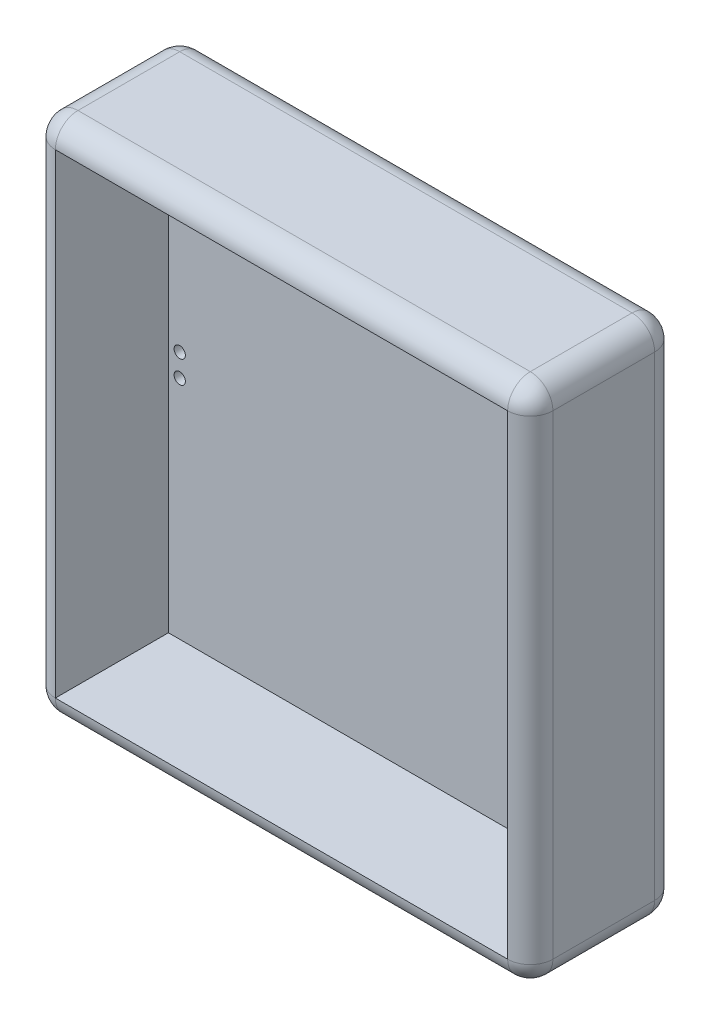
ISO-10303-21;
HEADER;
FILE_DESCRIPTION(('STEP AP214'),'2;1');
FILE_NAME('part.step','',(''),(''),'','','');
FILE_SCHEMA(('AUTOMOTIVE_DESIGN { 1 0 10303 214 1 1 1 1 }'));
ENDSEC;
DATA;
#1=APPLICATION_CONTEXT('core data for automotive mechanical design processes');
#2=APPLICATION_PROTOCOL_DEFINITION('international standard','automotive_design',2000,#1);
#3=PRODUCT_CONTEXT('',#1,'mechanical');
#4=PRODUCT('Part','Part','',(#3));
#5=PRODUCT_RELATED_PRODUCT_CATEGORY('part','',(#4));
#6=PRODUCT_DEFINITION_FORMATION('','',#4);
#7=PRODUCT_DEFINITION_CONTEXT('part definition',#1,'design');
#8=PRODUCT_DEFINITION('design','',#6,#7);
#9=PRODUCT_DEFINITION_SHAPE('','',#8);
#10=(LENGTH_UNIT() NAMED_UNIT(*) SI_UNIT(.MILLI.,.METRE.));
#11=(NAMED_UNIT(*) PLANE_ANGLE_UNIT() SI_UNIT($,.RADIAN.));
#12=(NAMED_UNIT(*) SI_UNIT($,.STERADIAN.) SOLID_ANGLE_UNIT());
#13=UNCERTAINTY_MEASURE_WITH_UNIT(LENGTH_MEASURE(1.E-05),#10,'distance_accuracy_value','');
#14=(GEOMETRIC_REPRESENTATION_CONTEXT(3) GLOBAL_UNCERTAINTY_ASSIGNED_CONTEXT((#13)) GLOBAL_UNIT_ASSIGNED_CONTEXT((#10,
#11,#12)) REPRESENTATION_CONTEXT('',''));
#15=CARTESIAN_POINT('',(0.,0.,0.));
#16=DIRECTION('',(0.,0.,1.));
#17=DIRECTION('',(1.,0.,0.));
#18=AXIS2_PLACEMENT_3D('',#15,#16,#17);
#19=CARTESIAN_POINT('',(0.,0.,10.));
#20=DIRECTION('',(-1.,0.,0.));
#21=DIRECTION('',(0.,0.,1.));
#22=AXIS2_PLACEMENT_3D('',#19,#20,#21);
#23=PLANE('',#22);
#24=DIRECTION('',(0.,1.,0.));
#25=VECTOR('',#24,1.);
#26=CARTESIAN_POINT('',(0.,0.,0.));
#27=LINE('',#26,#25);
#28=CARTESIAN_POINT('',(0.,0.,0.));
#29=VERTEX_POINT('',#28);
#30=CARTESIAN_POINT('',(0.,42.,0.));
#31=VERTEX_POINT('',#30);
#32=EDGE_CURVE('E140',#29,#31,#27,.T.);
#33=ORIENTED_EDGE('',*,*,#32,.F.);
#34=DIRECTION('',(0.,0.,-1.));
#35=VECTOR('',#34,1.);
#36=CARTESIAN_POINT('',(0.,0.,10.));
#37=LINE('',#36,#35);
#38=CARTESIAN_POINT('',(0.,0.,10.));
#39=VERTEX_POINT('',#38);
#40=EDGE_CURVE('E149',#39,#29,#37,.T.);
#41=ORIENTED_EDGE('',*,*,#40,.F.);
#42=DIRECTION('',(0.,1.,0.));
#43=VECTOR('',#42,1.);
#44=CARTESIAN_POINT('',(0.,0.,10.));
#45=LINE('',#44,#43);
#46=CARTESIAN_POINT('',(0.,42.,10.));
#47=VERTEX_POINT('',#46);
#48=EDGE_CURVE('E172',#39,#47,#45,.T.);
#49=ORIENTED_EDGE('',*,*,#48,.T.);
#50=DIRECTION('',(0.,0.,-1.));
#51=VECTOR('',#50,1.);
#52=CARTESIAN_POINT('',(0.,42.,10.));
#53=LINE('',#52,#51);
#54=EDGE_CURVE('E158',#47,#31,#53,.T.);
#55=ORIENTED_EDGE('',*,*,#54,.T.);
#56=EDGE_LOOP('',(#33,#41,#49,#55));
#57=FACE_BOUND('',#56,.T.);
#58=ADVANCED_FACE('F35',(#57),#23,.T.);
#59=CARTESIAN_POINT('',(0.,0.,10.));
#60=DIRECTION('',(0.,-1.,0.));
#61=DIRECTION('',(1.,0.,0.));
#62=AXIS2_PLACEMENT_3D('',#59,#60,#61);
#63=PLANE('',#62);
#64=DIRECTION('',(-1.,0.,0.));
#65=VECTOR('',#64,1.);
#66=CARTESIAN_POINT('',(0.,0.,0.));
#67=LINE('',#66,#65);
#68=CARTESIAN_POINT('',(-40.,0.,0.));
#69=VERTEX_POINT('',#68);
#70=EDGE_CURVE('E136',#29,#69,#67,.T.);
#71=ORIENTED_EDGE('',*,*,#70,.T.);
#72=DIRECTION('',(0.,0.,-1.));
#73=VECTOR('',#72,1.);
#74=CARTESIAN_POINT('',(-40.,0.,10.));
#75=LINE('',#74,#73);
#76=CARTESIAN_POINT('',(-40.,0.,10.));
#77=VERTEX_POINT('',#76);
#78=EDGE_CURVE('E156',#77,#69,#75,.T.);
#79=ORIENTED_EDGE('',*,*,#78,.F.);
#80=DIRECTION('',(-1.,0.,0.));
#81=VECTOR('',#80,1.);
#82=CARTESIAN_POINT('',(0.,0.,10.));
#83=LINE('',#82,#81);
#84=EDGE_CURVE('E152',#39,#77,#83,.T.);
#85=ORIENTED_EDGE('',*,*,#84,.F.);
#86=ORIENTED_EDGE('',*,*,#40,.T.);
#87=EDGE_LOOP('',(#71,#79,#85,#86));
#88=FACE_BOUND('',#87,.T.);
#89=ADVANCED_FACE('F150',(#88),#63,.F.);
#90=CARTESIAN_POINT('',(-40.,0.,10.));
#91=DIRECTION('',(1.,0.,0.));
#92=DIRECTION('',(0.,0.,-1.));
#93=AXIS2_PLACEMENT_3D('',#90,#91,#92);
#94=PLANE('',#93);
#95=DIRECTION('',(0.,-1.,0.));
#96=VECTOR('',#95,1.);
#97=CARTESIAN_POINT('',(-40.,0.,0.));
#98=LINE('',#97,#96);
#99=CARTESIAN_POINT('',(-40.,42.,0.));
#100=VERTEX_POINT('',#99);
#101=EDGE_CURVE('E143',#100,#69,#98,.T.);
#102=ORIENTED_EDGE('',*,*,#101,.F.);
#103=DIRECTION('',(0.,0.,-1.));
#104=VECTOR('',#103,1.);
#105=CARTESIAN_POINT('',(-40.,42.,10.));
#106=LINE('',#105,#104);
#107=CARTESIAN_POINT('',(-40.,42.,10.));
#108=VERTEX_POINT('',#107);
#109=EDGE_CURVE('E174',#108,#100,#106,.T.);
#110=ORIENTED_EDGE('',*,*,#109,.F.);
#111=DIRECTION('',(0.,-1.,0.));
#112=VECTOR('',#111,1.);
#113=CARTESIAN_POINT('',(-40.,0.,10.));
#114=LINE('',#113,#112);
#115=EDGE_CURVE('E312',#108,#77,#114,.T.);
#116=ORIENTED_EDGE('',*,*,#115,.T.);
#117=ORIENTED_EDGE('',*,*,#78,.T.);
#118=EDGE_LOOP('',(#102,#110,#116,#117));
#119=FACE_BOUND('',#118,.T.);
#120=ADVANCED_FACE('F377',(#119),#94,.T.);
#121=CARTESIAN_POINT('',(0.,-2.,10.));
#122=DIRECTION('',(0.,-1.,0.));
#123=DIRECTION('',(1.,0.,0.));
#124=AXIS2_PLACEMENT_3D('',#121,#122,#123);
#125=PLANE('',#124);
#126=DIRECTION('',(-1.,0.,0.));
#127=VECTOR('',#126,1.);
#128=CARTESIAN_POINT('',(0.,-2.,8.));
#129=LINE('',#128,#127);
#130=CARTESIAN_POINT('',(0.,-2.,8.));
#131=VERTEX_POINT('',#130);
#132=CARTESIAN_POINT('',(-40.,-2.,8.));
#133=VERTEX_POINT('',#132);
#134=EDGE_CURVE('E203',#131,#133,#129,.T.);
#135=ORIENTED_EDGE('',*,*,#134,.T.);
#136=DIRECTION('',(0.,0.,-1.));
#137=VECTOR('',#136,1.);
#138=CARTESIAN_POINT('',(-40.,-2.,10.));
#139=LINE('',#138,#137);
#140=CARTESIAN_POINT('',(-40.,-2.,-0.999999999999999));
#141=VERTEX_POINT('',#140);
#142=EDGE_CURVE('E206',#133,#141,#139,.T.);
#143=ORIENTED_EDGE('',*,*,#142,.T.);
#144=DIRECTION('',(1.,0.,0.));
#145=VECTOR('',#144,1.);
#146=CARTESIAN_POINT('',(0.,-2.,-0.999999999999999));
#147=LINE('',#146,#145);
#148=CARTESIAN_POINT('',(0.,-2.,-0.999999999999999));
#149=VERTEX_POINT('',#148);
#150=EDGE_CURVE('E195',#141,#149,#147,.T.);
#151=ORIENTED_EDGE('',*,*,#150,.T.);
#152=DIRECTION('',(0.,0.,-1.));
#153=VECTOR('',#152,1.);
#154=CARTESIAN_POINT('',(0.,-2.,10.));
#155=LINE('',#154,#153);
#156=EDGE_CURVE('E200',#149,#131,#155,.F.);
#157=ORIENTED_EDGE('',*,*,#156,.T.);
#158=EDGE_LOOP('',(#135,#143,#151,#157));
#159=FACE_BOUND('',#158,.T.);
#160=ADVANCED_FACE('F295',(#159),#125,.T.);
#161=CARTESIAN_POINT('',(2.,0.,10.));
#162=DIRECTION('',(-1.,0.,0.));
#163=DIRECTION('',(0.,0.,1.));
#164=AXIS2_PLACEMENT_3D('',#161,#162,#163);
#165=PLANE('',#164);
#166=DIRECTION('',(0.,0.,-1.));
#167=VECTOR('',#166,1.);
#168=CARTESIAN_POINT('',(2.,42.,10.));
#169=LINE('',#168,#167);
#170=CARTESIAN_POINT('',(2.,42.,-0.999999999999999));
#171=VERTEX_POINT('',#170);
#172=CARTESIAN_POINT('',(2.,42.,8.));
#173=VERTEX_POINT('',#172);
#174=EDGE_CURVE('E186',#171,#173,#169,.F.);
#175=ORIENTED_EDGE('',*,*,#174,.T.);
#176=DIRECTION('',(0.,1.,0.));
#177=VECTOR('',#176,1.);
#178=CARTESIAN_POINT('',(2.,0.,8.));
#179=LINE('',#178,#177);
#180=CARTESIAN_POINT('',(2.,0.,8.));
#181=VERTEX_POINT('',#180);
#182=EDGE_CURVE('E233',#173,#181,#179,.F.);
#183=ORIENTED_EDGE('',*,*,#182,.T.);
#184=DIRECTION('',(0.,0.,-1.));
#185=VECTOR('',#184,1.);
#186=CARTESIAN_POINT('',(2.,0.,-0.999999999999999));
#187=LINE('',#186,#185);
#188=CARTESIAN_POINT('',(2.,0.,-0.999999999999999));
#189=VERTEX_POINT('',#188);
#190=EDGE_CURVE('E212',#181,#189,#187,.T.);
#191=ORIENTED_EDGE('',*,*,#190,.T.);
#192=DIRECTION('',(0.,1.,0.));
#193=VECTOR('',#192,1.);
#194=CARTESIAN_POINT('',(2.,0.,-0.999999999999999));
#195=LINE('',#194,#193);
#196=EDGE_CURVE('E184',#189,#171,#195,.T.);
#197=ORIENTED_EDGE('',*,*,#196,.T.);
#198=EDGE_LOOP('',(#175,#183,#191,#197));
#199=FACE_BOUND('',#198,.T.);
#200=ADVANCED_FACE('F372',(#199),#165,.F.);
#201=CARTESIAN_POINT('',(0.,44.,10.));
#202=DIRECTION('',(0.,1.,0.));
#203=DIRECTION('',(0.,0.,1.));
#204=AXIS2_PLACEMENT_3D('',#201,#202,#203);
#205=PLANE('',#204);
#206=DIRECTION('',(-1.,0.,0.));
#207=VECTOR('',#206,1.);
#208=CARTESIAN_POINT('',(-42.,44.,-0.999999999999999));
#209=LINE('',#208,#207);
#210=CARTESIAN_POINT('',(0.,44.,-0.999999999999999));
#211=VERTEX_POINT('',#210);
#212=CARTESIAN_POINT('',(-40.,44.,-0.999999999999999));
#213=VERTEX_POINT('',#212);
#214=EDGE_CURVE('E155',#211,#213,#209,.T.);
#215=ORIENTED_EDGE('',*,*,#214,.T.);
#216=DIRECTION('',(0.,0.,-1.));
#217=VECTOR('',#216,1.);
#218=CARTESIAN_POINT('',(-40.,44.,10.));
#219=LINE('',#218,#217);
#220=CARTESIAN_POINT('',(-40.,44.,8.));
#221=VERTEX_POINT('',#220);
#222=EDGE_CURVE('E257',#213,#221,#219,.F.);
#223=ORIENTED_EDGE('',*,*,#222,.T.);
#224=DIRECTION('',(1.,0.,0.));
#225=VECTOR('',#224,1.);
#226=CARTESIAN_POINT('',(0.,44.,8.));
#227=LINE('',#226,#225);
#228=CARTESIAN_POINT('',(0.,44.,8.));
#229=VERTEX_POINT('',#228);
#230=EDGE_CURVE('E229',#221,#229,#227,.T.);
#231=ORIENTED_EDGE('',*,*,#230,.T.);
#232=DIRECTION('',(0.,0.,-1.));
#233=VECTOR('',#232,1.);
#234=CARTESIAN_POINT('',(0.,44.,-0.999999999999999));
#235=LINE('',#234,#233);
#236=EDGE_CURVE('E182',#229,#211,#235,.T.);
#237=ORIENTED_EDGE('',*,*,#236,.T.);
#238=EDGE_LOOP('',(#215,#223,#231,#237));
#239=FACE_BOUND('',#238,.T.);
#240=ADVANCED_FACE('F348',(#239),#205,.T.);
#241=CARTESIAN_POINT('',(-42.,0.,10.));
#242=DIRECTION('',(-1.,0.,0.));
#243=DIRECTION('',(0.,0.,1.));
#244=AXIS2_PLACEMENT_3D('',#241,#242,#243);
#245=PLANE('',#244);
#246=DIRECTION('',(0.,0.,-1.));
#247=VECTOR('',#246,1.);
#248=CARTESIAN_POINT('',(-42.,0.,10.));
#249=LINE('',#248,#247);
#250=CARTESIAN_POINT('',(-42.,0.,-0.999999999999999));
#251=VERTEX_POINT('',#250);
#252=CARTESIAN_POINT('',(-42.,0.,8.));
#253=VERTEX_POINT('',#252);
#254=EDGE_CURVE('E209',#251,#253,#249,.F.);
#255=ORIENTED_EDGE('',*,*,#254,.T.);
#256=DIRECTION('',(0.,1.,0.));
#257=VECTOR('',#256,1.);
#258=CARTESIAN_POINT('',(-42.,0.,8.));
#259=LINE('',#258,#257);
#260=CARTESIAN_POINT('',(-42.,42.,8.));
#261=VERTEX_POINT('',#260);
#262=EDGE_CURVE('E253',#253,#261,#259,.T.);
#263=ORIENTED_EDGE('',*,*,#262,.T.);
#264=DIRECTION('',(0.,0.,-1.));
#265=VECTOR('',#264,1.);
#266=CARTESIAN_POINT('',(-42.,42.,10.));
#267=LINE('',#266,#265);
#268=CARTESIAN_POINT('',(-42.,42.,-0.999999999999999));
#269=VERTEX_POINT('',#268);
#270=EDGE_CURVE('E251',#261,#269,#267,.T.);
#271=ORIENTED_EDGE('',*,*,#270,.T.);
#272=DIRECTION('',(0.,-1.,0.));
#273=VECTOR('',#272,1.);
#274=CARTESIAN_POINT('',(-42.,0.,-0.999999999999999));
#275=LINE('',#274,#273);
#276=EDGE_CURVE('E249',#269,#251,#275,.T.);
#277=ORIENTED_EDGE('',*,*,#276,.T.);
#278=EDGE_LOOP('',(#255,#263,#271,#277));
#279=FACE_BOUND('',#278,.T.);
#280=ADVANCED_FACE('F338',(#279),#245,.T.);
#281=CARTESIAN_POINT('',(0.,42.,10.));
#282=DIRECTION('',(0.,-1.,0.));
#283=DIRECTION('',(0.,0.,-1.));
#284=AXIS2_PLACEMENT_3D('',#281,#282,#283);
#285=PLANE('',#284);
#286=DIRECTION('',(-1.,0.,0.));
#287=VECTOR('',#286,1.);
#288=CARTESIAN_POINT('',(0.,42.,0.));
#289=LINE('',#288,#287);
#290=EDGE_CURVE('E170',#31,#100,#289,.T.);
#291=ORIENTED_EDGE('',*,*,#290,.F.);
#292=ORIENTED_EDGE('',*,*,#54,.F.);
#293=DIRECTION('',(-1.,0.,0.));
#294=VECTOR('',#293,1.);
#295=CARTESIAN_POINT('',(0.,42.,10.));
#296=LINE('',#295,#294);
#297=EDGE_CURVE('E166',#47,#108,#296,.T.);
#298=ORIENTED_EDGE('',*,*,#297,.T.);
#299=ORIENTED_EDGE('',*,*,#109,.T.);
#300=EDGE_LOOP('',(#291,#292,#298,#299));
#301=FACE_BOUND('',#300,.T.);
#302=ADVANCED_FACE('F324',(#301),#285,.T.);
#303=CARTESIAN_POINT('',(0.,0.,0.));
#304=DIRECTION('',(0.,0.,1.));
#305=DIRECTION('',(1.,0.,0.));
#306=AXIS2_PLACEMENT_3D('',#303,#304,#305);
#307=PLANE('',#306);
#308=CARTESIAN_POINT('',(-39.,20.,0.));
#309=DIRECTION('',(0.,0.,1.));
#310=DIRECTION('',(1.,0.,0.));
#311=AXIS2_PLACEMENT_3D('',#308,#309,#310);
#312=CIRCLE('',#311,0.499999999999999);
#313=CARTESIAN_POINT('',(-38.5,20.,0.));
#314=VERTEX_POINT('',#313);
#315=EDGE_CURVE('E674',#314,#314,#312,.T.);
#316=ORIENTED_EDGE('',*,*,#315,.F.);
#317=EDGE_LOOP('',(#316));
#318=FACE_BOUND('',#317,.T.);
#319=CARTESIAN_POINT('',(-39.,22.,0.));
#320=DIRECTION('',(0.,0.,1.));
#321=DIRECTION('',(1.,0.,0.));
#322=AXIS2_PLACEMENT_3D('',#319,#320,#321);
#323=CIRCLE('',#322,0.499999999999999);
#324=CARTESIAN_POINT('',(-38.5,22.,0.));
#325=VERTEX_POINT('',#324);
#326=EDGE_CURVE('E315',#325,#325,#323,.T.);
#327=ORIENTED_EDGE('',*,*,#326,.F.);
#328=EDGE_LOOP('',(#327));
#329=FACE_BOUND('',#328,.T.);
#330=ORIENTED_EDGE('',*,*,#70,.F.);
#331=ORIENTED_EDGE('',*,*,#32,.T.);
#332=ORIENTED_EDGE('',*,*,#290,.T.);
#333=ORIENTED_EDGE('',*,*,#101,.T.);
#334=EDGE_LOOP('',(#330,#331,#332,#333));
#335=FACE_BOUND('',#334,.T.);
#336=ADVANCED_FACE('F138',(#318,#329,#335),#307,.T.);
#337=CARTESIAN_POINT('',(0.,0.,-3.));
#338=DIRECTION('',(0.,0.,1.));
#339=DIRECTION('',(1.,0.,0.));
#340=AXIS2_PLACEMENT_3D('',#337,#338,#339);
#341=PLANE('',#340);
#342=CARTESIAN_POINT('',(-39.,20.,-3.));
#343=DIRECTION('',(0.,0.,1.));
#344=DIRECTION('',(1.,0.,0.));
#345=AXIS2_PLACEMENT_3D('',#342,#343,#344);
#346=CIRCLE('',#345,0.499999999999999);
#347=CARTESIAN_POINT('',(-38.5,20.,-3.));
#348=VERTEX_POINT('',#347);
#349=EDGE_CURVE('E265',#348,#348,#346,.T.);
#350=ORIENTED_EDGE('',*,*,#349,.T.);
#351=EDGE_LOOP('',(#350));
#352=FACE_BOUND('',#351,.T.);
#353=CARTESIAN_POINT('',(-39.,22.,-3.));
#354=DIRECTION('',(0.,0.,1.));
#355=DIRECTION('',(1.,0.,0.));
#356=AXIS2_PLACEMENT_3D('',#353,#354,#355);
#357=CIRCLE('',#356,0.499999999999999);
#358=CARTESIAN_POINT('',(-38.5,22.,-3.));
#359=VERTEX_POINT('',#358);
#360=EDGE_CURVE('E675',#359,#359,#357,.T.);
#361=ORIENTED_EDGE('',*,*,#360,.T.);
#362=EDGE_LOOP('',(#361));
#363=FACE_BOUND('',#362,.T.);
#364=DIRECTION('',(1.,0.,0.));
#365=VECTOR('',#364,1.);
#366=CARTESIAN_POINT('',(-42.,0.,-3.));
#367=LINE('',#366,#365);
#368=CARTESIAN_POINT('',(0.,0.,-3.));
#369=VERTEX_POINT('',#368);
#370=CARTESIAN_POINT('',(-40.,0.,-3.));
#371=VERTEX_POINT('',#370);
#372=EDGE_CURVE('E216',#369,#371,#367,.F.);
#373=ORIENTED_EDGE('',*,*,#372,.T.);
#374=DIRECTION('',(0.,-1.,0.));
#375=VECTOR('',#374,1.);
#376=CARTESIAN_POINT('',(-40.,42.,-3.));
#377=LINE('',#376,#375);
#378=CARTESIAN_POINT('',(-40.,42.,-3.));
#379=VERTEX_POINT('',#378);
#380=EDGE_CURVE('E11',#371,#379,#377,.F.);
#381=ORIENTED_EDGE('',*,*,#380,.T.);
#382=DIRECTION('',(-1.,0.,0.));
#383=VECTOR('',#382,1.);
#384=CARTESIAN_POINT('',(2.,42.,-3.));
#385=LINE('',#384,#383);
#386=CARTESIAN_POINT('',(0.,42.,-3.));
#387=VERTEX_POINT('',#386);
#388=EDGE_CURVE('E180',#379,#387,#385,.F.);
#389=ORIENTED_EDGE('',*,*,#388,.T.);
#390=DIRECTION('',(0.,1.,0.));
#391=VECTOR('',#390,1.);
#392=CARTESIAN_POINT('',(0.,0.,-3.));
#393=LINE('',#392,#391);
#394=EDGE_CURVE('E192',#387,#369,#393,.F.);
#395=ORIENTED_EDGE('',*,*,#394,.T.);
#396=EDGE_LOOP('',(#373,#381,#389,#395));
#397=FACE_BOUND('',#396,.T.);
#398=ADVANCED_FACE('F364',(#352,#363,#397),#341,.F.);
#399=CARTESIAN_POINT('',(0.,42.,-0.999999999999999));
#400=DIRECTION('',(1.,0.,0.));
#401=DIRECTION('',(0.,0.,-1.));
#402=AXIS2_PLACEMENT_3D('',#399,#400,#401);
#403=CYLINDRICAL_SURFACE('',#402,2.);
#404=ORIENTED_EDGE('',*,*,#388,.F.);
#405=CARTESIAN_POINT('',(-40.,42.,-0.999999999999999));
#406=DIRECTION('',(1.,0.,0.));
#407=DIRECTION('',(0.,0.,-1.));
#408=AXIS2_PLACEMENT_3D('',#405,#406,#407);
#409=CIRCLE('',#408,2.);
#410=EDGE_CURVE('E259',#379,#213,#409,.T.);
#411=ORIENTED_EDGE('',*,*,#410,.T.);
#412=ORIENTED_EDGE('',*,*,#214,.F.);
#413=CARTESIAN_POINT('',(0.,42.,-0.999999999999999));
#414=DIRECTION('',(1.,0.,0.));
#415=DIRECTION('',(0.,0.,-1.));
#416=AXIS2_PLACEMENT_3D('',#413,#414,#415);
#417=CIRCLE('',#416,2.);
#418=EDGE_CURVE('E189',#211,#387,#417,.F.);
#419=ORIENTED_EDGE('',*,*,#418,.T.);
#420=EDGE_LOOP('',(#404,#411,#412,#419));
#421=FACE_BOUND('',#420,.T.);
#422=ADVANCED_FACE('F346',(#421),#403,.T.);
#423=CARTESIAN_POINT('',(0.,0.,-0.999999999999999));
#424=DIRECTION('',(0.,1.,0.));
#425=DIRECTION('',(0.,0.,1.));
#426=AXIS2_PLACEMENT_3D('',#423,#424,#425);
#427=CYLINDRICAL_SURFACE('',#426,2.);
#428=ORIENTED_EDGE('',*,*,#196,.F.);
#429=CARTESIAN_POINT('',(0.,0.,-0.999999999999999));
#430=DIRECTION('',(0.,1.,0.));
#431=DIRECTION('',(0.,0.,1.));
#432=AXIS2_PLACEMENT_3D('',#429,#430,#431);
#433=CIRCLE('',#432,2.);
#434=EDGE_CURVE('E214',#189,#369,#433,.T.);
#435=ORIENTED_EDGE('',*,*,#434,.T.);
#436=ORIENTED_EDGE('',*,*,#394,.F.);
#437=CARTESIAN_POINT('',(0.,42.,-0.999999999999999));
#438=DIRECTION('',(0.,1.,0.));
#439=DIRECTION('',(0.,0.,1.));
#440=AXIS2_PLACEMENT_3D('',#437,#438,#439);
#441=CIRCLE('',#440,2.);
#442=EDGE_CURVE('E160',#171,#387,#441,.T.);
#443=ORIENTED_EDGE('',*,*,#442,.F.);
#444=EDGE_LOOP('',(#428,#435,#436,#443));
#445=FACE_BOUND('',#444,.T.);
#446=ADVANCED_FACE('F362',(#445),#427,.T.);
#447=CARTESIAN_POINT('',(0.,42.,-0.999999999999999));
#448=DIRECTION('',(-1.,0.,0.));
#449=DIRECTION('',(0.,0.,1.));
#450=AXIS2_PLACEMENT_3D('',#447,#448,#449);
#451=SPHERICAL_SURFACE('',#450,2.);
#452=ORIENTED_EDGE('',*,*,#442,.T.);
#453=ORIENTED_EDGE('',*,*,#418,.F.);
#454=CARTESIAN_POINT('',(0.,42.,-0.999999999999999));
#455=DIRECTION('',(0.,0.,1.));
#456=DIRECTION('',(1.,0.,0.));
#457=AXIS2_PLACEMENT_3D('',#454,#455,#456);
#458=CIRCLE('',#457,2.);
#459=EDGE_CURVE('E163',#171,#211,#458,.T.);
#460=ORIENTED_EDGE('',*,*,#459,.F.);
#461=EDGE_LOOP('',(#452,#453,#460));
#462=FACE_BOUND('',#461,.T.);
#463=ADVANCED_FACE('F357',(#462),#451,.T.);
#464=CARTESIAN_POINT('',(0.,42.,10.));
#465=DIRECTION('',(0.,0.,1.));
#466=DIRECTION('',(1.,0.,0.));
#467=AXIS2_PLACEMENT_3D('',#464,#465,#466);
#468=CYLINDRICAL_SURFACE('',#467,2.);
#469=ORIENTED_EDGE('',*,*,#236,.F.);
#470=CARTESIAN_POINT('',(0.,42.,8.));
#471=DIRECTION('',(0.,0.,1.));
#472=DIRECTION('',(1.,0.,0.));
#473=AXIS2_PLACEMENT_3D('',#470,#471,#472);
#474=CIRCLE('',#473,2.);
#475=EDGE_CURVE('E231',#229,#173,#474,.F.);
#476=ORIENTED_EDGE('',*,*,#475,.T.);
#477=ORIENTED_EDGE('',*,*,#174,.F.);
#478=ORIENTED_EDGE('',*,*,#459,.T.);
#479=EDGE_LOOP('',(#469,#476,#477,#478));
#480=FACE_BOUND('',#479,.T.);
#481=ADVANCED_FACE('F355',(#480),#468,.T.);
#482=CARTESIAN_POINT('',(0.,0.,10.));
#483=DIRECTION('',(0.,0.,1.));
#484=DIRECTION('',(1.,0.,0.));
#485=AXIS2_PLACEMENT_3D('',#482,#483,#484);
#486=CYLINDRICAL_SURFACE('',#485,2.);
#487=ORIENTED_EDGE('',*,*,#190,.F.);
#488=CARTESIAN_POINT('',(0.,0.,8.));
#489=DIRECTION('',(0.,0.,1.));
#490=DIRECTION('',(1.,0.,0.));
#491=AXIS2_PLACEMENT_3D('',#488,#489,#490);
#492=CIRCLE('',#491,2.);
#493=EDGE_CURVE('E227',#181,#131,#492,.F.);
#494=ORIENTED_EDGE('',*,*,#493,.T.);
#495=ORIENTED_EDGE('',*,*,#156,.F.);
#496=CARTESIAN_POINT('',(0.,0.,-0.999999999999999));
#497=DIRECTION('',(0.,0.,-1.));
#498=DIRECTION('',(-1.,0.,0.));
#499=AXIS2_PLACEMENT_3D('',#496,#497,#498);
#500=CIRCLE('',#499,2.);
#501=EDGE_CURVE('E197',#189,#149,#500,.T.);
#502=ORIENTED_EDGE('',*,*,#501,.F.);
#503=EDGE_LOOP('',(#487,#494,#495,#502));
#504=FACE_BOUND('',#503,.T.);
#505=ADVANCED_FACE('F370',(#504),#486,.T.);
#506=CARTESIAN_POINT('',(0.,0.,-0.999999999999999));
#507=DIRECTION('',(0.,-1.,0.));
#508=DIRECTION('',(1.,0.,0.));
#509=AXIS2_PLACEMENT_3D('',#506,#507,#508);
#510=SPHERICAL_SURFACE('',#509,2.);
#511=ORIENTED_EDGE('',*,*,#434,.F.);
#512=ORIENTED_EDGE('',*,*,#501,.T.);
#513=CARTESIAN_POINT('',(0.,0.,-0.999999999999999));
#514=DIRECTION('',(-1.,0.,0.));
#515=DIRECTION('',(0.,-1.,0.));
#516=AXIS2_PLACEMENT_3D('',#513,#514,#515);
#517=CIRCLE('',#516,2.);
#518=EDGE_CURVE('E219',#369,#149,#517,.T.);
#519=ORIENTED_EDGE('',*,*,#518,.F.);
#520=EDGE_LOOP('',(#511,#512,#519));
#521=FACE_BOUND('',#520,.T.);
#522=ADVANCED_FACE('F366',(#521),#510,.T.);
#523=CARTESIAN_POINT('',(0.,0.,8.));
#524=DIRECTION('',(-1.,0.,0.));
#525=DIRECTION('',(0.,-1.,0.));
#526=AXIS2_PLACEMENT_3D('',#523,#524,#525);
#527=CYLINDRICAL_SURFACE('',#526,2.);
#528=ORIENTED_EDGE('',*,*,#84,.T.);
#529=CARTESIAN_POINT('',(-40.,0.,8.));
#530=DIRECTION('',(-1.,0.,0.));
#531=DIRECTION('',(0.,-1.,0.));
#532=AXIS2_PLACEMENT_3D('',#529,#530,#531);
#533=CIRCLE('',#532,2.);
#534=EDGE_CURVE('E247',#77,#133,#533,.F.);
#535=ORIENTED_EDGE('',*,*,#534,.T.);
#536=ORIENTED_EDGE('',*,*,#134,.F.);
#537=CARTESIAN_POINT('',(0.,0.,8.));
#538=DIRECTION('',(-1.,0.,0.));
#539=DIRECTION('',(0.,-1.,0.));
#540=AXIS2_PLACEMENT_3D('',#537,#538,#539);
#541=CIRCLE('',#540,2.);
#542=EDGE_CURVE('E218',#131,#39,#541,.T.);
#543=ORIENTED_EDGE('',*,*,#542,.T.);
#544=EDGE_LOOP('',(#528,#535,#536,#543));
#545=FACE_BOUND('',#544,.T.);
#546=ADVANCED_FACE('F299',(#545),#527,.T.);
#547=CARTESIAN_POINT('',(0.,0.,-0.999999999999999));
#548=DIRECTION('',(-1.,0.,0.));
#549=DIRECTION('',(0.,-1.,0.));
#550=AXIS2_PLACEMENT_3D('',#547,#548,#549);
#551=CYLINDRICAL_SURFACE('',#550,2.);
#552=ORIENTED_EDGE('',*,*,#150,.F.);
#553=CARTESIAN_POINT('',(-40.,0.,-0.999999999999999));
#554=DIRECTION('',(-1.,0.,0.));
#555=DIRECTION('',(0.,-1.,0.));
#556=AXIS2_PLACEMENT_3D('',#553,#554,#555);
#557=CIRCLE('',#556,2.);
#558=EDGE_CURVE('E44',#141,#371,#557,.F.);
#559=ORIENTED_EDGE('',*,*,#558,.T.);
#560=ORIENTED_EDGE('',*,*,#372,.F.);
#561=ORIENTED_EDGE('',*,*,#518,.T.);
#562=EDGE_LOOP('',(#552,#559,#560,#561));
#563=FACE_BOUND('',#562,.T.);
#564=ADVANCED_FACE('F291',(#563),#551,.T.);
#565=CARTESIAN_POINT('',(-40.,0.,10.));
#566=DIRECTION('',(0.,0.,-1.));
#567=DIRECTION('',(-1.,0.,0.));
#568=AXIS2_PLACEMENT_3D('',#565,#566,#567);
#569=CYLINDRICAL_SURFACE('',#568,2.);
#570=ORIENTED_EDGE('',*,*,#142,.F.);
#571=CARTESIAN_POINT('',(-40.,0.,8.));
#572=DIRECTION('',(0.,0.,-1.));
#573=DIRECTION('',(-1.,0.,0.));
#574=AXIS2_PLACEMENT_3D('',#571,#572,#573);
#575=CIRCLE('',#574,2.);
#576=EDGE_CURVE('E244',#133,#253,#575,.T.);
#577=ORIENTED_EDGE('',*,*,#576,.T.);
#578=ORIENTED_EDGE('',*,*,#254,.F.);
#579=CARTESIAN_POINT('',(-40.,0.,-0.999999999999999));
#580=DIRECTION('',(0.,0.,-1.));
#581=DIRECTION('',(-1.,0.,0.));
#582=AXIS2_PLACEMENT_3D('',#579,#580,#581);
#583=CIRCLE('',#582,2.);
#584=EDGE_CURVE('E235',#251,#141,#583,.F.);
#585=ORIENTED_EDGE('',*,*,#584,.T.);
#586=EDGE_LOOP('',(#570,#577,#578,#585));
#587=FACE_BOUND('',#586,.T.);
#588=ADVANCED_FACE('F289',(#587),#569,.T.);
#589=CARTESIAN_POINT('',(0.,42.,8.));
#590=DIRECTION('',(1.,0.,0.));
#591=DIRECTION('',(0.,0.,-1.));
#592=AXIS2_PLACEMENT_3D('',#589,#590,#591);
#593=CYLINDRICAL_SURFACE('',#592,2.);
#594=ORIENTED_EDGE('',*,*,#230,.F.);
#595=CARTESIAN_POINT('',(-40.,42.,8.));
#596=DIRECTION('',(1.,0.,0.));
#597=DIRECTION('',(0.,0.,-1.));
#598=AXIS2_PLACEMENT_3D('',#595,#596,#597);
#599=CIRCLE('',#598,2.);
#600=EDGE_CURVE('E255',#221,#108,#599,.T.);
#601=ORIENTED_EDGE('',*,*,#600,.T.);
#602=ORIENTED_EDGE('',*,*,#297,.F.);
#603=CARTESIAN_POINT('',(0.,42.,8.));
#604=DIRECTION('',(1.,0.,0.));
#605=DIRECTION('',(0.,0.,-1.));
#606=AXIS2_PLACEMENT_3D('',#603,#604,#605);
#607=CIRCLE('',#606,2.);
#608=EDGE_CURVE('E222',#229,#47,#607,.T.);
#609=ORIENTED_EDGE('',*,*,#608,.F.);
#610=EDGE_LOOP('',(#594,#601,#602,#609));
#611=FACE_BOUND('',#610,.T.);
#612=ADVANCED_FACE('F376',(#611),#593,.T.);
#613=CARTESIAN_POINT('',(0.,42.,8.));
#614=DIRECTION('',(0.,0.,1.));
#615=DIRECTION('',(1.,0.,0.));
#616=AXIS2_PLACEMENT_3D('',#613,#614,#615);
#617=SPHERICAL_SURFACE('',#616,2.);
#618=ORIENTED_EDGE('',*,*,#475,.F.);
#619=ORIENTED_EDGE('',*,*,#608,.T.);
#620=CARTESIAN_POINT('',(0.,42.,8.));
#621=DIRECTION('',(0.,-1.,0.));
#622=DIRECTION('',(0.,0.,-1.));
#623=AXIS2_PLACEMENT_3D('',#620,#621,#622);
#624=CIRCLE('',#623,2.);
#625=EDGE_CURVE('E238',#173,#47,#624,.T.);
#626=ORIENTED_EDGE('',*,*,#625,.F.);
#627=EDGE_LOOP('',(#618,#619,#626));
#628=FACE_BOUND('',#627,.T.);
#629=ADVANCED_FACE('F375',(#628),#617,.T.);
#630=CARTESIAN_POINT('',(0.,0.,8.));
#631=DIRECTION('',(0.,-1.,0.));
#632=DIRECTION('',(0.,0.,-1.));
#633=AXIS2_PLACEMENT_3D('',#630,#631,#632);
#634=CYLINDRICAL_SURFACE('',#633,2.);
#635=ORIENTED_EDGE('',*,*,#625,.T.);
#636=ORIENTED_EDGE('',*,*,#48,.F.);
#637=CARTESIAN_POINT('',(0.,0.,8.));
#638=DIRECTION('',(0.,-1.,0.));
#639=DIRECTION('',(0.,0.,-1.));
#640=AXIS2_PLACEMENT_3D('',#637,#638,#639);
#641=CIRCLE('',#640,2.);
#642=EDGE_CURVE('E236',#181,#39,#641,.T.);
#643=ORIENTED_EDGE('',*,*,#642,.F.);
#644=ORIENTED_EDGE('',*,*,#182,.F.);
#645=EDGE_LOOP('',(#635,#636,#643,#644));
#646=FACE_BOUND('',#645,.T.);
#647=ADVANCED_FACE('F308',(#646),#634,.T.);
#648=CARTESIAN_POINT('',(0.,0.,8.));
#649=DIRECTION('',(0.,0.,1.));
#650=DIRECTION('',(1.,0.,0.));
#651=AXIS2_PLACEMENT_3D('',#648,#649,#650);
#652=SPHERICAL_SURFACE('',#651,2.);
#653=ORIENTED_EDGE('',*,*,#542,.F.);
#654=ORIENTED_EDGE('',*,*,#493,.F.);
#655=ORIENTED_EDGE('',*,*,#642,.T.);
#656=EDGE_LOOP('',(#653,#654,#655));
#657=FACE_BOUND('',#656,.T.);
#658=ADVANCED_FACE('F303',(#657),#652,.T.);
#659=CARTESIAN_POINT('',(-40.,0.,-0.999999999999999));
#660=DIRECTION('',(0.,0.,1.));
#661=DIRECTION('',(1.,0.,0.));
#662=AXIS2_PLACEMENT_3D('',#659,#660,#661);
#663=SPHERICAL_SURFACE('',#662,2.);
#664=ORIENTED_EDGE('',*,*,#558,.F.);
#665=ORIENTED_EDGE('',*,*,#584,.F.);
#666=CARTESIAN_POINT('',(-40.,0.,-0.999999999999999));
#667=DIRECTION('',(0.,1.,0.));
#668=DIRECTION('',(0.,0.,1.));
#669=AXIS2_PLACEMENT_3D('',#666,#667,#668);
#670=CIRCLE('',#669,2.);
#671=EDGE_CURVE('E39',#371,#251,#670,.T.);
#672=ORIENTED_EDGE('',*,*,#671,.F.);
#673=EDGE_LOOP('',(#664,#665,#672));
#674=FACE_BOUND('',#673,.T.);
#675=ADVANCED_FACE('F37',(#674),#663,.T.);
#676=CARTESIAN_POINT('',(-40.,0.,-0.999999999999999));
#677=DIRECTION('',(0.,1.,0.));
#678=DIRECTION('',(0.,0.,1.));
#679=AXIS2_PLACEMENT_3D('',#676,#677,#678);
#680=CYLINDRICAL_SURFACE('',#679,2.);
#681=CARTESIAN_POINT('',(-40.,42.,-1.));
#682=DIRECTION('',(0.,1.,0.));
#683=DIRECTION('',(0.,0.,1.));
#684=AXIS2_PLACEMENT_3D('',#681,#682,#683);
#685=CIRCLE('',#684,2.);
#686=EDGE_CURVE('E273',#379,#269,#685,.T.);
#687=ORIENTED_EDGE('',*,*,#686,.F.);
#688=ORIENTED_EDGE('',*,*,#380,.F.);
#689=ORIENTED_EDGE('',*,*,#671,.T.);
#690=ORIENTED_EDGE('',*,*,#276,.F.);
#691=EDGE_LOOP('',(#687,#688,#689,#690));
#692=FACE_BOUND('',#691,.T.);
#693=ADVANCED_FACE('F283',(#692),#680,.T.);
#694=CARTESIAN_POINT('',(-40.,42.,-0.999999999999999));
#695=DIRECTION('',(-1.,0.,0.));
#696=DIRECTION('',(0.,0.,1.));
#697=AXIS2_PLACEMENT_3D('',#694,#695,#696);
#698=SPHERICAL_SURFACE('',#697,2.);
#699=ORIENTED_EDGE('',*,*,#410,.F.);
#700=ORIENTED_EDGE('',*,*,#686,.T.);
#701=CARTESIAN_POINT('',(-40.,42.,-0.999999999999999));
#702=DIRECTION('',(0.,0.,1.));
#703=DIRECTION('',(1.,0.,0.));
#704=AXIS2_PLACEMENT_3D('',#701,#702,#703);
#705=CIRCLE('',#704,2.);
#706=EDGE_CURVE('E271',#213,#269,#705,.T.);
#707=ORIENTED_EDGE('',*,*,#706,.F.);
#708=EDGE_LOOP('',(#699,#700,#707));
#709=FACE_BOUND('',#708,.T.);
#710=ADVANCED_FACE('F343',(#709),#698,.T.);
#711=CARTESIAN_POINT('',(-40.,42.,10.));
#712=DIRECTION('',(0.,0.,-1.));
#713=DIRECTION('',(-1.,0.,0.));
#714=AXIS2_PLACEMENT_3D('',#711,#712,#713);
#715=CYLINDRICAL_SURFACE('',#714,2.);
#716=CARTESIAN_POINT('',(-40.,42.,8.));
#717=DIRECTION('',(0.,0.,1.));
#718=DIRECTION('',(1.,0.,0.));
#719=AXIS2_PLACEMENT_3D('',#716,#717,#718);
#720=CIRCLE('',#719,2.);
#721=EDGE_CURVE('E268',#221,#261,#720,.T.);
#722=ORIENTED_EDGE('',*,*,#721,.F.);
#723=ORIENTED_EDGE('',*,*,#222,.F.);
#724=ORIENTED_EDGE('',*,*,#706,.T.);
#725=ORIENTED_EDGE('',*,*,#270,.F.);
#726=EDGE_LOOP('',(#722,#723,#724,#725));
#727=FACE_BOUND('',#726,.T.);
#728=ADVANCED_FACE('F341',(#727),#715,.T.);
#729=CARTESIAN_POINT('',(-40.,42.,8.));
#730=DIRECTION('',(-1.,0.,0.));
#731=DIRECTION('',(0.,0.,1.));
#732=AXIS2_PLACEMENT_3D('',#729,#730,#731);
#733=SPHERICAL_SURFACE('',#732,2.);
#734=ORIENTED_EDGE('',*,*,#600,.F.);
#735=ORIENTED_EDGE('',*,*,#721,.T.);
#736=CARTESIAN_POINT('',(-40.,42.,8.));
#737=DIRECTION('',(0.,-1.,0.));
#738=DIRECTION('',(0.,0.,-1.));
#739=AXIS2_PLACEMENT_3D('',#736,#737,#738);
#740=CIRCLE('',#739,2.);
#741=EDGE_CURVE('E264',#108,#261,#740,.T.);
#742=ORIENTED_EDGE('',*,*,#741,.F.);
#743=EDGE_LOOP('',(#734,#735,#742));
#744=FACE_BOUND('',#743,.T.);
#745=ADVANCED_FACE('F329',(#744),#733,.T.);
#746=CARTESIAN_POINT('',(-40.,0.,8.));
#747=DIRECTION('',(0.,1.,0.));
#748=DIRECTION('',(0.,0.,1.));
#749=AXIS2_PLACEMENT_3D('',#746,#747,#748);
#750=CYLINDRICAL_SURFACE('',#749,2.);
#751=ORIENTED_EDGE('',*,*,#741,.T.);
#752=ORIENTED_EDGE('',*,*,#262,.F.);
#753=CARTESIAN_POINT('',(-40.,0.,8.));
#754=DIRECTION('',(0.,-1.,0.));
#755=DIRECTION('',(0.,0.,-1.));
#756=AXIS2_PLACEMENT_3D('',#753,#754,#755);
#757=CIRCLE('',#756,2.);
#758=EDGE_CURVE('E262',#77,#253,#757,.T.);
#759=ORIENTED_EDGE('',*,*,#758,.F.);
#760=ORIENTED_EDGE('',*,*,#115,.F.);
#761=EDGE_LOOP('',(#751,#752,#759,#760));
#762=FACE_BOUND('',#761,.T.);
#763=ADVANCED_FACE('F334',(#762),#750,.T.);
#764=CARTESIAN_POINT('',(-40.,0.,8.));
#765=DIRECTION('',(0.,0.,1.));
#766=DIRECTION('',(1.,0.,0.));
#767=AXIS2_PLACEMENT_3D('',#764,#765,#766);
#768=SPHERICAL_SURFACE('',#767,2.);
#769=ORIENTED_EDGE('',*,*,#576,.F.);
#770=ORIENTED_EDGE('',*,*,#534,.F.);
#771=ORIENTED_EDGE('',*,*,#758,.T.);
#772=EDGE_LOOP('',(#769,#770,#771));
#773=FACE_BOUND('',#772,.T.);
#774=ADVANCED_FACE('F336',(#773),#768,.T.);
#775=CARTESIAN_POINT('',(-39.,22.,-3.));
#776=DIRECTION('',(0.,0.,1.));
#777=DIRECTION('',(1.,0.,0.));
#778=AXIS2_PLACEMENT_3D('',#775,#776,#777);
#779=CYLINDRICAL_SURFACE('',#778,0.499999999999999);
#780=ORIENTED_EDGE('',*,*,#360,.F.);
#781=EDGE_LOOP('',(#780));
#782=FACE_BOUND('',#781,.T.);
#783=ORIENTED_EDGE('',*,*,#326,.T.);
#784=EDGE_LOOP('',(#783));
#785=FACE_BOUND('',#784,.T.);
#786=ADVANCED_FACE('F426',(#782,#785),#779,.F.);
#787=CARTESIAN_POINT('',(-39.,20.,-3.));
#788=DIRECTION('',(0.,0.,1.));
#789=DIRECTION('',(1.,0.,0.));
#790=AXIS2_PLACEMENT_3D('',#787,#788,#789);
#791=CYLINDRICAL_SURFACE('',#790,0.499999999999999);
#792=ORIENTED_EDGE('',*,*,#349,.F.);
#793=EDGE_LOOP('',(#792));
#794=FACE_BOUND('',#793,.T.);
#795=ORIENTED_EDGE('',*,*,#315,.T.);
#796=EDGE_LOOP('',(#795));
#797=FACE_BOUND('',#796,.T.);
#798=ADVANCED_FACE('F651',(#794,#797),#791,.F.);
#799=CLOSED_SHELL('',(#58,#89,#120,#160,#200,#240,#280,#302,#336,#398,#422,#446,#463,#481,#505,
#522,#546,#564,#588,#612,#629,#647,#658,#675,#693,#710,#728,#745,#763,#774,#786,#798));
#800=MANIFOLD_SOLID_BREP('B2',#799);
#801=ADVANCED_BREP_SHAPE_REPRESENTATION('',(#18,#800),#14);
#802=SHAPE_DEFINITION_REPRESENTATION(#9,#801);
ENDSEC;
END-ISO-10303-21;
